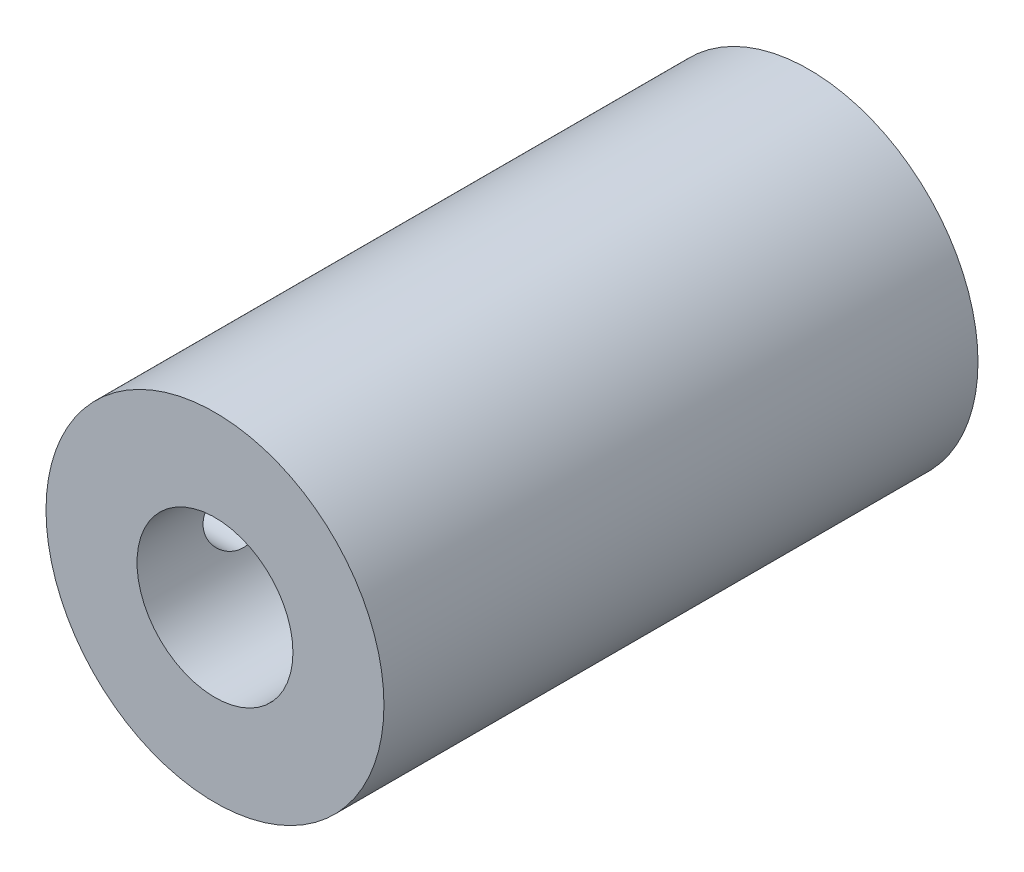
ISO-10303-21;
HEADER;
FILE_DESCRIPTION(('STEP AP214'),'2;1');
FILE_NAME('part.step','',(''),(''),'','','');
FILE_SCHEMA(('AUTOMOTIVE_DESIGN { 1 0 10303 214 1 1 1 1 }'));
ENDSEC;
DATA;
#1=APPLICATION_CONTEXT('core data for automotive mechanical design processes');
#2=APPLICATION_PROTOCOL_DEFINITION('international standard','automotive_design',2000,#1);
#3=PRODUCT_CONTEXT('',#1,'mechanical');
#4=PRODUCT('Part','Part','',(#3));
#5=PRODUCT_RELATED_PRODUCT_CATEGORY('part','',(#4));
#6=PRODUCT_DEFINITION_FORMATION('','',#4);
#7=PRODUCT_DEFINITION_CONTEXT('part definition',#1,'design');
#8=PRODUCT_DEFINITION('design','',#6,#7);
#9=PRODUCT_DEFINITION_SHAPE('','',#8);
#10=(LENGTH_UNIT() NAMED_UNIT(*) SI_UNIT(.MILLI.,.METRE.));
#11=(NAMED_UNIT(*) PLANE_ANGLE_UNIT() SI_UNIT($,.RADIAN.));
#12=(NAMED_UNIT(*) SI_UNIT($,.STERADIAN.) SOLID_ANGLE_UNIT());
#13=UNCERTAINTY_MEASURE_WITH_UNIT(LENGTH_MEASURE(1.E-05),#10,'distance_accuracy_value','');
#14=(GEOMETRIC_REPRESENTATION_CONTEXT(3) GLOBAL_UNCERTAINTY_ASSIGNED_CONTEXT((#13)) GLOBAL_UNIT_ASSIGNED_CONTEXT((#10,
#11,#12)) REPRESENTATION_CONTEXT('',''));
#15=CARTESIAN_POINT('',(0.,0.,0.));
#16=DIRECTION('',(0.,0.,1.));
#17=DIRECTION('',(1.,0.,0.));
#18=AXIS2_PLACEMENT_3D('',#15,#16,#17);
#19=CARTESIAN_POINT('',(0.,0.,57.15));
#20=DIRECTION('',(0.,0.,1.));
#21=DIRECTION('',(1.,0.,0.));
#22=AXIS2_PLACEMENT_3D('',#19,#20,#21);
#23=PLANE('',#22);
#24=CARTESIAN_POINT('',(0.,0.,57.15));
#25=DIRECTION('',(0.,0.,1.));
#26=DIRECTION('',(1.,0.,0.));
#27=AXIS2_PLACEMENT_3D('',#24,#25,#26);
#28=CIRCLE('',#27,32.512);
#29=CARTESIAN_POINT('',(32.512,0.,57.15));
#30=VERTEX_POINT('',#29);
#31=EDGE_CURVE('E10',#30,#30,#28,.T.);
#32=ORIENTED_EDGE('',*,*,#31,.T.);
#33=EDGE_LOOP('',(#32));
#34=FACE_BOUND('',#33,.T.);
#35=CARTESIAN_POINT('',(0.,0.,57.15));
#36=DIRECTION('',(0.,0.,1.));
#37=DIRECTION('',(1.,0.,0.));
#38=AXIS2_PLACEMENT_3D('',#35,#36,#37);
#39=CIRCLE('',#38,15.);
#40=CARTESIAN_POINT('',(15.,0.,57.15));
#41=VERTEX_POINT('',#40);
#42=EDGE_CURVE('E50',#41,#41,#39,.T.);
#43=ORIENTED_EDGE('',*,*,#42,.F.);
#44=EDGE_LOOP('',(#43));
#45=FACE_BOUND('',#44,.T.);
#46=ADVANCED_FACE('F37',(#34,#45),#23,.T.);
#47=CARTESIAN_POINT('',(0.,0.,-57.15));
#48=DIRECTION('',(0.,0.,1.));
#49=DIRECTION('',(1.,0.,0.));
#50=AXIS2_PLACEMENT_3D('',#47,#48,#49);
#51=PLANE('',#50);
#52=CARTESIAN_POINT('',(0.,0.,-57.15));
#53=DIRECTION('',(0.,0.,1.));
#54=DIRECTION('',(1.,0.,0.));
#55=AXIS2_PLACEMENT_3D('',#52,#53,#54);
#56=CIRCLE('',#55,32.512);
#57=CARTESIAN_POINT('',(32.512,0.,-57.15));
#58=VERTEX_POINT('',#57);
#59=EDGE_CURVE('E41',#58,#58,#56,.T.);
#60=ORIENTED_EDGE('',*,*,#59,.F.);
#61=EDGE_LOOP('',(#60));
#62=FACE_BOUND('',#61,.T.);
#63=CARTESIAN_POINT('',(0.,0.,-57.15));
#64=DIRECTION('',(0.,0.,1.));
#65=DIRECTION('',(1.,0.,0.));
#66=AXIS2_PLACEMENT_3D('',#63,#64,#65);
#67=CIRCLE('',#66,15.);
#68=CARTESIAN_POINT('',(15.,0.,-57.15));
#69=VERTEX_POINT('',#68);
#70=EDGE_CURVE('E52',#69,#69,#67,.T.);
#71=ORIENTED_EDGE('',*,*,#70,.T.);
#72=EDGE_LOOP('',(#71));
#73=FACE_BOUND('',#72,.T.);
#74=ADVANCED_FACE('F116',(#62,#73),#51,.F.);
#75=CARTESIAN_POINT('',(0.,0.,57.15));
#76=DIRECTION('',(0.,0.,-1.));
#77=DIRECTION('',(-1.,0.,0.));
#78=AXIS2_PLACEMENT_3D('',#75,#76,#77);
#79=CYLINDRICAL_SURFACE('',#78,32.512);
#80=CARTESIAN_POINT('',(0.,-32.512,3.5));
#81=CARTESIAN_POINT('',(-0.195988137658058,-32.5119975915341,3.49999155492031));
#82=CARTESIAN_POINT('',(-0.392103848105158,-32.5102090240905,3.48348254459472));
#83=CARTESIAN_POINT('',(-0.778892480967858,-32.503246074273,3.41787730173676));
#84=CARTESIAN_POINT('',(-0.969559260852604,-32.4980680168033,3.36874569692743));
#85=CARTESIAN_POINT('',(-1.33979337204176,-32.484910265371,3.23934710280458));
#86=CARTESIAN_POINT('',(-1.5193675443441,-32.4769323188493,3.15909953003361));
#87=CARTESIAN_POINT('',(-1.86246061193985,-32.459065512138,2.96978603911861));
#88=CARTESIAN_POINT('',(-2.0259825669953,-32.4491770171947,2.86072562776428));
#89=CARTESIAN_POINT('',(-2.3330440022052,-32.4285500082528,2.61639842348212));
#90=CARTESIAN_POINT('',(-2.4765076157144,-32.4178084958187,2.48103652813698));
#91=CARTESIAN_POINT('',(-2.73872747966971,-32.3967107027665,2.18815214871714));
#92=CARTESIAN_POINT('',(-2.85748255577241,-32.3863544404777,2.03062861194363));
#93=CARTESIAN_POINT('',(-3.06718743588402,-32.3671694927108,1.69741185384869));
#94=CARTESIAN_POINT('',(-3.15806782675932,-32.3583446440637,1.5216747085621));
#95=CARTESIAN_POINT('',(-3.30900035354277,-32.3432597038847,1.15732308006718));
#96=CARTESIAN_POINT('',(-3.36905336520914,-32.336999539495,0.968708962846211));
#97=CARTESIAN_POINT('',(-3.45639973962269,-32.3277804089811,0.584735759088976));
#98=CARTESIAN_POINT('',(-3.4838196875941,-32.3248086899908,0.389405779595353));
#99=CARTESIAN_POINT('',(-3.50551299696881,-32.3224635239406,-0.00310456987558333));
#100=CARTESIAN_POINT('',(-3.49978735962951,-32.3230899681878,-0.2002848837786));
#101=CARTESIAN_POINT('',(-3.45545623800254,-32.3278586916782,-0.590023387581798));
#102=CARTESIAN_POINT('',(-3.41698931038841,-32.331986154834,-0.782597544571943));
#103=CARTESIAN_POINT('',(-3.30848330181597,-32.3432687283133,-1.15854081797322));
#104=CARTESIAN_POINT('',(-3.23844373357843,-32.3504238853649,-1.34190979226678));
#105=CARTESIAN_POINT('',(-3.06862880891097,-32.366972630745,-1.6946731740357));
#106=CARTESIAN_POINT('',(-2.9687923375093,-32.3763708116155,-1.86403793748449));
#107=CARTESIAN_POINT('',(-2.74226145401603,-32.3963428926896,-2.18366074083776));
#108=CARTESIAN_POINT('',(-2.61556613040442,-32.4069168327896,-2.33391813201048));
#109=CARTESIAN_POINT('',(-2.33814177658311,-32.4281150096147,-2.61186582592699));
#110=CARTESIAN_POINT('',(-2.1872931502924,-32.4387392270135,-2.73943678966168));
#111=CARTESIAN_POINT('',(-1.86625851870228,-32.4587899623452,-2.96746419658234));
#112=CARTESIAN_POINT('',(-1.69607248614531,-32.4682164785898,-3.06792060154756));
#113=CARTESIAN_POINT('',(-1.34110867087321,-32.4848135246738,-3.23886388981305));
#114=CARTESIAN_POINT('',(-1.15632775526068,-32.4919835684896,-3.30934431770885));
#115=CARTESIAN_POINT('',(-0.777460183030065,-32.5032550280162,-3.41824545946518));
#116=CARTESIAN_POINT('',(-0.583373849320703,-32.5073565501265,-3.45666728494588));
#117=CARTESIAN_POINT('',(-0.192437856610683,-32.5120151264474,-3.50020824565802));
#118=CARTESIAN_POINT('',(0.00439326990537216,-32.5125896988246,-3.50549197883277));
#119=CARTESIAN_POINT('',(0.396138203291622,-32.510176702945,-3.48303966515436));
#120=CARTESIAN_POINT('',(0.591052040212017,-32.5071891906077,-3.45530413665515));
#121=CARTESIAN_POINT('',(0.972951431857776,-32.4979988272656,-3.36773721980575));
#122=CARTESIAN_POINT('',(1.15995495236783,-32.4918037382828,-3.30798330069913));
#123=CARTESIAN_POINT('',(1.52128483373895,-32.4768927948867,-3.15815567163437));
#124=CARTESIAN_POINT('',(1.69561086787794,-32.4681768755357,-3.06808118059595));
#125=CARTESIAN_POINT('',(2.02737894278774,-32.4491545821586,-2.85976391211357));
#126=CARTESIAN_POINT('',(2.18475302522111,-32.4388421830743,-2.74141346276595));
#127=CARTESIAN_POINT('',(2.47746102468969,-32.417802319831,-2.48005760896636));
#128=CARTESIAN_POINT('',(2.61279429848234,-32.4070748435697,-2.33705148520982));
#129=CARTESIAN_POINT('',(2.85815412155572,-32.3863607808955,-2.0297235310665));
#130=CARTESIAN_POINT('',(2.96807233313026,-32.3763774848377,-1.865314954342));
#131=CARTESIAN_POINT('',(3.15873606257725,-32.3583334122136,-1.52027493256778));
#132=CARTESIAN_POINT('',(3.23948203355378,-32.3502726057878,-1.33964373954263));
#133=CARTESIAN_POINT('',(3.36932950931284,-32.3370073330573,-0.967651246696535));
#134=CARTESIAN_POINT('',(3.41849451567803,-32.3317971380206,-0.77631232552887));
#135=CARTESIAN_POINT('',(3.48399007879071,-32.3248056376962,-0.388035742411539));
#136=CARTESIAN_POINT('',(3.50032174098656,-32.3230242169671,-0.19109826918295));
#137=CARTESIAN_POINT('',(3.49967028980366,-32.3230946734711,0.20170805462654));
#138=CARTESIAN_POINT('',(3.48285735763207,-32.3249279908079,0.397577212879774));
#139=CARTESIAN_POINT('',(3.41675180425235,-32.3319816900138,0.783690501588419));
#140=CARTESIAN_POINT('',(3.36745915466954,-32.3372020748417,0.973934627129581));
#141=CARTESIAN_POINT('',(3.23784219125406,-32.3504363898705,1.3433901516139));
#142=CARTESIAN_POINT('',(3.15752380165866,-32.3584497867286,1.52260364924073));
#143=CARTESIAN_POINT('',(2.96815248991178,-32.37636824831,1.86503416653832));
#144=CARTESIAN_POINT('',(2.85909957975963,-32.3862733122432,2.02825119288906));
#145=CARTESIAN_POINT('',(2.61471743486441,-32.4069200280989,2.33492749141207));
#146=CARTESIAN_POINT('',(2.47926127683855,-32.4176655645828,2.47828536415543));
#147=CARTESIAN_POINT('',(2.18617450738013,-32.4387472634636,2.7403072567575));
#148=CARTESIAN_POINT('',(2.02853861768916,-32.449083327663,2.85896538193858));
#149=CARTESIAN_POINT('',(1.69506328056527,-32.46821301941,3.06849522972541));
#150=CARTESIAN_POINT('',(1.51917286608502,-32.4770021330578,3.15928619298112));
#151=CARTESIAN_POINT('',(1.15465671207614,-32.4919997963383,3.30992052253017));
#152=CARTESIAN_POINT('',(0.966045452498568,-32.4982112243486,3.36979842629204));
#153=CARTESIAN_POINT('',(0.64699280047804,-32.5058107159333,3.44214403217882));
#154=CARTESIAN_POINT('',(0.518583723798975,-32.5081207388091,3.46380994765421));
#155=CARTESIAN_POINT('',(0.260135163139251,-32.5112161764176,3.49274069868829));
#156=CARTESIAN_POINT('',(0.130095687261573,-32.5120015987244,3.50000560579053));
#157=CARTESIAN_POINT('',(0.,-32.512,3.5));
#158=B_SPLINE_CURVE_WITH_KNOTS('',3,(#80,#81,#82,#83,#84,#85,#86,#87,#88,#89,#90,#91,#92,#93,
#94,#95,#96,#97,#98,#99,#100,#101,#102,#103,#104,#105,#106,#107,#108,#109,#110,#111,#112,#113,
#114,#115,#116,#117,#118,#119,#120,#121,#122,#123,#124,#125,#126,#127,#128,#129,#130,#131,#132,
#133,#134,#135,#136,#137,#138,#139,#140,#141,#142,#143,#144,#145,#146,#147,#148,#149,#150,#151,
#152,#153,#154,#155,#156,#157),.UNSPECIFIED.,.T.,.F.,(4,2,2,2,2,2,2,2,2,2,2,2,2,2,2,2,2,2,2,2,2,
2,2,2,2,2,2,2,2,2,2,2,2,2,2,2,2,2,4),(0.,0.587489314310103,1.17561667855041,1.76337763701815,
2.35102634214334,2.94084083017574,3.53068334441656,4.12198296908031,4.71326579490527,
5.30224745172805,5.89121131676452,6.4776950888052,7.06418791270661,7.65189202819732,
8.23961609204001,8.83034580692934,9.42107635450834,10.0119340531083,10.6027712630846,
11.1906714265722,11.7785623610119,12.3650372602703,12.9515272687108,13.5402871999731,
14.1290643106234,14.7203067630256,15.3115400318377,15.9015807228829,16.4916015478301,
17.0786007954386,17.6656005558577,18.2524882864516,18.8393757719657,19.4291573468929,
20.0190795142057,20.610695483418,21.2016490342503,21.5916226659203,21.9815943602141),.UNSPECIFIED.);
#159=CARTESIAN_POINT('',(0.,-32.512,3.5));
#160=VERTEX_POINT('',#159);
#161=EDGE_CURVE('E93',#160,#160,#158,.T.);
#162=ORIENTED_EDGE('',*,*,#161,.F.);
#163=EDGE_LOOP('',(#162));
#164=FACE_BOUND('',#163,.T.);
#165=CARTESIAN_POINT('',(-32.512,0.,31.75));
#166=CARTESIAN_POINT('',(-32.5120016887293,-0.176602159807082,31.7499966087641));
#167=CARTESIAN_POINT('',(-32.5105585523844,-0.353161351814694,31.7573692802022));
#168=CARTESIAN_POINT('',(-32.5048299809116,-0.705058782748434,31.7867953012497));
#169=CARTESIAN_POINT('',(-32.5005440534453,-0.880396804865951,31.8088511938244));
#170=CARTESIAN_POINT('',(-32.4892443483677,-1.22862655690052,31.8674903759749));
#171=CARTESIAN_POINT('',(-32.4822291140138,-1.40151692924858,31.9040814237767));
#172=CARTESIAN_POINT('',(-32.4656640461168,-1.74359834107074,31.9915189590452));
#173=CARTESIAN_POINT('',(-32.4561132813133,-1.91278799656666,32.0423706846215));
#174=CARTESIAN_POINT('',(-32.4347574003561,-2.24599526442921,32.1578575742648));
#175=CARTESIAN_POINT('',(-32.4229552789448,-2.410019413983,32.2224744411967));
#176=CARTESIAN_POINT('',(-32.3974084644323,-2.73206383920705,32.3650762124475));
#177=CARTESIAN_POINT('',(-32.3836630553959,-2.89008187479169,32.4430660458247));
#178=CARTESIAN_POINT('',(-32.3546155724962,-3.19891281263923,32.6117940401822));
#179=CARTESIAN_POINT('',(-32.33931420825,-3.34972895372457,32.7025263968713));
#180=CARTESIAN_POINT('',(-32.3075599733595,-3.6432843133998,32.8961639929611));
#181=CARTESIAN_POINT('',(-32.291106674044,-3.78602048906139,32.999073773901));
#182=CARTESIAN_POINT('',(-32.2573113476593,-4.06396737198189,33.2175553288928));
#183=CARTESIAN_POINT('',(-32.2399614139576,-4.19907554269305,33.3332563426647));
#184=CARTESIAN_POINT('',(-32.2050211630908,-4.45914579030272,33.5756079165574));
#185=CARTESIAN_POINT('',(-32.1874307592425,-4.58410408940359,33.7022625177337));
#186=CARTESIAN_POINT('',(-32.1525112572201,-4.82293781477474,33.9655887132862));
#187=CARTESIAN_POINT('',(-32.1351820845234,-4.93681645436059,34.1022573831092));
#188=CARTESIAN_POINT('',(-32.101259563557,-5.15278910776555,34.3847756387688));
#189=CARTESIAN_POINT('',(-32.084666489035,-5.25487875963127,34.5306285921637));
#190=CARTESIAN_POINT('',(-32.0525604335111,-5.44730323412573,34.8317327296527));
#191=CARTESIAN_POINT('',(-32.037057555077,-5.53753351135553,34.9870518439412));
#192=CARTESIAN_POINT('',(-32.0077310771142,-5.70460263183618,35.3049556925829));
#193=CARTESIAN_POINT('',(-31.993908107761,-5.78143645441505,35.4675431223691));
#194=CARTESIAN_POINT('',(-31.9683634195623,-5.92105888811862,35.7987358895413));
#195=CARTESIAN_POINT('',(-31.9566407693909,-5.98385372750218,35.9673385196919));
#196=CARTESIAN_POINT('',(-31.9356326627974,-6.09496954431065,36.3093939101622));
#197=CARTESIAN_POINT('',(-31.9263480915842,-6.14328526560585,36.4828484068578));
#198=CARTESIAN_POINT('',(-31.9028166507062,-6.26479171430735,37.004233975871));
#199=CARTESIAN_POINT('',(-31.892528565595,-6.31645908082194,37.357752084779));
#200=CARTESIAN_POINT('',(-31.8860424312432,-6.34904442064811,37.8902908754231));
#201=CARTESIAN_POINT('',(-31.8853729320443,-6.35241248602985,38.0682534338425));
#202=CARTESIAN_POINT('',(-31.8870027220047,-6.3442279925067,38.4238433960152));
#203=CARTESIAN_POINT('',(-31.8893020577279,-6.33267519957964,38.6014707944681));
#204=CARTESIAN_POINT('',(-31.9004856821443,-6.27621915883915,39.1267089634019));
#205=CARTESIAN_POINT('',(-31.9135928306721,-6.20984165439541,39.4721642721973));
#206=CARTESIAN_POINT('',(-31.9496955863877,-6.02130582922637,40.1467582555932));
#207=CARTESIAN_POINT('',(-31.9726916460043,-5.89914495633332,40.4758961828867));
#208=CARTESIAN_POINT('',(-32.0261474557354,-5.60168846580636,41.1112027494515));
#209=CARTESIAN_POINT('',(-32.0566545264941,-5.42605422904104,41.4172090252473));
#210=CARTESIAN_POINT('',(-32.1216658574928,-5.02687687803046,41.9957121085928));
#211=CARTESIAN_POINT('',(-32.1561705564521,-4.80332850316004,42.268205231467));
#212=CARTESIAN_POINT('',(-32.2260144384059,-4.3101145552833,42.7768606804358));
#213=CARTESIAN_POINT('',(-32.2613577895546,-4.03972441450775,43.0123204896568));
#214=CARTESIAN_POINT('',(-32.3283546569013,-3.46291659507378,43.4346487150129));
#215=CARTESIAN_POINT('',(-32.3600081298806,-3.15649849451366,43.6215165620346));
#216=CARTESIAN_POINT('',(-32.4161310593656,-2.51557057937647,43.9414774371207));
#217=CARTESIAN_POINT('',(-32.4405901426244,-2.18102108790852,44.0744929209714));
#218=CARTESIAN_POINT('',(-32.479489176964,-1.49374110703744,44.2822386635693));
#219=CARTESIAN_POINT('',(-32.4939302844908,-1.14101272120475,44.3569756499401));
#220=CARTESIAN_POINT('',(-32.5110060329331,-0.433427810151222,44.4450547291255));
#221=CARTESIAN_POINT('',(-32.5138256378891,-0.0786953470219535,44.4593587462885));
#222=CARTESIAN_POINT('',(-32.5078533610769,0.628091521723579,44.428752375724));
#223=CARTESIAN_POINT('',(-32.4990621004856,0.980146069593901,44.3838451557762));
#224=CARTESIAN_POINT('',(-32.4709714241727,1.66850017091416,44.2368908037442));
#225=CARTESIAN_POINT('',(-32.4517623346946,2.00490854623474,44.1353346252274));
#226=CARTESIAN_POINT('',(-32.4049815501422,2.65592278441464,43.8784984237995));
#227=CARTESIAN_POINT('',(-32.3774092505067,2.97052706907526,43.723214516894));
#228=CARTESIAN_POINT('',(-32.3164995787678,3.57307679018632,43.3612361205278));
#229=CARTESIAN_POINT('',(-32.2830982998081,3.86066572341816,43.1539592386953));
#230=CARTESIAN_POINT('',(-32.2143909909299,4.39732745024845,42.6946442220376));
#231=CARTESIAN_POINT('',(-32.1790847671675,4.64639631410343,42.4426015259177));
#232=CARTESIAN_POINT('',(-32.109928679655,5.1026210943753,41.8966052884571));
#233=CARTESIAN_POINT('',(-32.0761073055025,5.30911791204254,41.602097740244));
#234=CARTESIAN_POINT('',(-32.0143356174298,5.66975735098072,40.9818115617374));
#235=CARTESIAN_POINT('',(-31.9863850745921,5.82390201372909,40.6560341514507));
#236=CARTESIAN_POINT('',(-31.9513809946409,6.01193231647523,40.1521377490732));
#237=CARTESIAN_POINT('',(-31.9408809145982,6.06734240703577,39.9819940793897));
#238=CARTESIAN_POINT('',(-31.9224394510239,6.16363825111149,39.6375252116311));
#239=CARTESIAN_POINT('',(-31.914497131452,6.20452931858497,39.4632015684144));
#240=CARTESIAN_POINT('',(-31.9014126530402,6.27145699018935,39.1116175039844));
#241=CARTESIAN_POINT('',(-31.8962707460447,6.29749225833137,38.9343568201163));
#242=CARTESIAN_POINT('',(-31.8889423499701,6.33449754129185,38.5782107791845));
#243=CARTESIAN_POINT('',(-31.8867557531126,6.34546810551153,38.3993254816089));
#244=CARTESIAN_POINT('',(-31.8854164398573,6.35219427234065,38.0443538350264));
#245=CARTESIAN_POINT('',(-31.886211953158,6.34820950246738,37.8682725324916));
#246=CARTESIAN_POINT('',(-31.8906977622183,6.32563613201158,37.5170883858007));
#247=CARTESIAN_POINT('',(-31.894388003964,6.30704780392317,37.3419855234488));
#248=CARTESIAN_POINT('',(-31.904555628774,6.25541084660078,36.9939778205225));
#249=CARTESIAN_POINT('',(-31.9110334884117,6.22235974478313,36.8210733609949));
#250=CARTESIAN_POINT('',(-31.9265843225604,6.14207021484257,36.4787763364809));
#251=CARTESIAN_POINT('',(-31.9356563700129,6.09483685458818,36.3093825400753));
#252=CARTESIAN_POINT('',(-31.9561150355424,5.9866416427995,35.9755341373992));
#253=CARTESIAN_POINT('',(-31.9674973015973,5.92570558164878,35.8110709017719));
#254=CARTESIAN_POINT('',(-31.9922584405732,5.7905319290815,35.4879313839254));
#255=CARTESIAN_POINT('',(-32.0056366055139,5.71629905241182,35.3292530744276));
#256=CARTESIAN_POINT('',(-32.0340228262748,5.55501835091317,35.0186187657404));
#257=CARTESIAN_POINT('',(-32.0490315524099,5.46796525048983,34.8666655676108));
#258=CARTESIAN_POINT('',(-32.0802526403924,5.28170846197777,34.5706045783677));
#259=CARTESIAN_POINT('',(-32.0964645868975,5.18250895911848,34.4264941095059));
#260=CARTESIAN_POINT('',(-32.1299283099282,4.97086656010199,34.1446806892537));
#261=CARTESIAN_POINT('',(-32.1471928768459,4.85823122690573,34.0071237373989));
#262=CARTESIAN_POINT('',(-32.1820216449737,4.62189192694554,33.7420026396424));
#263=CARTESIAN_POINT('',(-32.1995857385159,4.49819187234851,33.6144349914955));
#264=CARTESIAN_POINT('',(-32.2345413113329,4.24044917346016,33.3700263545268));
#265=CARTESIAN_POINT('',(-32.2519326821528,4.10640044381951,33.2531917668775));
#266=CARTESIAN_POINT('',(-32.2860432352847,3.82897859480911,33.0311761545678));
#267=CARTESIAN_POINT('',(-32.3027626627509,3.68560892702832,32.9259908546894));
#268=CARTESIAN_POINT('',(-32.3352392279339,3.38894334095262,32.7269378209407));
#269=CARTESIAN_POINT('',(-32.3509846796739,3.23556038901374,32.6331978235907));
#270=CARTESIAN_POINT('',(-32.3808711680076,2.92133936002422,32.4590307760273));
#271=CARTESIAN_POINT('',(-32.3950127949618,2.76050405705841,32.3785988221474));
#272=CARTESIAN_POINT('',(-32.4212874276069,2.432549154217,32.2316557808447));
#273=CARTESIAN_POINT('',(-32.4334216745747,2.26543351688459,32.1651360839083));
#274=CARTESIAN_POINT('',(-32.4553431220064,1.926079236736,32.0464853422129));
#275=CARTESIAN_POINT('',(-32.4651307824605,1.75384160541284,31.9943514771649));
#276=CARTESIAN_POINT('',(-32.4861258139016,1.3221439225647,31.8834874133768));
#277=CARTESIAN_POINT('',(-32.4957790382063,1.06031042491715,31.8334965500122));
#278=CARTESIAN_POINT('',(-32.5087147656899,0.532285350044574,31.7667558851373));
#279=CARTESIAN_POINT('',(-32.5119974555205,0.26609390073459,31.7500051097178));
#280=CARTESIAN_POINT('',(-32.512,0.,31.75));
#281=B_SPLINE_CURVE_WITH_KNOTS('',3,(#165,#166,#167,#168,#169,#170,#171,#172,#173,#174,#175,
#176,#177,#178,#179,#180,#181,#182,#183,#184,#185,#186,#187,#188,#189,#190,#191,#192,#193,#194,
#195,#196,#197,#198,#199,#200,#201,#202,#203,#204,#205,#206,#207,#208,#209,#210,#211,#212,#213,
#214,#215,#216,#217,#218,#219,#220,#221,#222,#223,#224,#225,#226,#227,#228,#229,#230,#231,#232,
#233,#234,#235,#236,#237,#238,#239,#240,#241,#242,#243,#244,#245,#246,#247,#248,#249,#250,#251,
#252,#253,#254,#255,#256,#257,#258,#259,#260,#261,#262,#263,#264,#265,#266,#267,#268,#269,#270,
#271,#272,#273,#274,#275,#276,#277,#278,#279,#280),.UNSPECIFIED.,.T.,.F.,(4,2,2,2,2,2,2,2,2,2,2,
2,2,2,2,2,2,2,2,2,2,2,2,2,2,2,2,2,2,2,2,2,2,2,2,2,2,2,2,2,2,2,2,2,2,2,2,2,2,2,2,2,2,2,2,2,2,4),
(0.,0.529572890188593,1.05923752019195,1.58918524255536,2.11932787629711,2.64877017354801,
3.17840803575998,3.70780542273493,4.23740087309335,4.77294489752799,5.30868734748042,
5.84427395568624,6.3800581015176,6.92028715870093,7.46071824768892,8.00090910178718,
8.54129581611107,9.60736036725825,10.1408258598928,10.6742997196243,11.7249672374627,
12.7756828296384,13.8331955550117,14.8908244471493,15.9665754038923,17.0423389593603,
18.1196460878807,19.1968288345014,20.2567996828716,21.3167138254861,22.3675817272649,
23.4185256124939,24.4818127395284,25.5452082696194,26.6240012670084,27.7027521919272,
28.2399542933079,28.7769595757092,29.3140131436347,29.8510471250008,30.3788015655476,
30.9065461587292,31.4343810114141,31.9620274723444,32.4886890203658,33.0151641945726,
33.5418566248031,34.0683680830861,34.6036160401726,35.1386754914597,35.6740520069611,
36.2092313868581,36.7499233716226,37.290415679668,37.8305725111963,38.3706233716254,
39.1685764948691,39.9665062383531),.UNSPECIFIED.);
#282=CARTESIAN_POINT('',(-32.512,0.,31.75));
#283=VERTEX_POINT('',#282);
#284=EDGE_CURVE('E56',#283,#283,#281,.T.);
#285=ORIENTED_EDGE('',*,*,#284,.F.);
#286=EDGE_LOOP('',(#285));
#287=FACE_BOUND('',#286,.T.);
#288=ORIENTED_EDGE('',*,*,#31,.F.);
#289=EDGE_LOOP('',(#288));
#290=FACE_BOUND('',#289,.T.);
#291=ORIENTED_EDGE('',*,*,#59,.T.);
#292=EDGE_LOOP('',(#291));
#293=FACE_BOUND('',#292,.T.);
#294=ADVANCED_FACE('F39',(#164,#287,#290,#293),#79,.T.);
#295=CARTESIAN_POINT('',(0.,0.,57.15));
#296=DIRECTION('',(0.,0.,-1.));
#297=DIRECTION('',(-1.,0.,0.));
#298=AXIS2_PLACEMENT_3D('',#295,#296,#297);
#299=CYLINDRICAL_SURFACE('',#298,15.);
#300=CARTESIAN_POINT('',(0.,-15.,3.5));
#301=CARTESIAN_POINT('',(-0.193784137952152,-14.9999965115519,3.49999387624454));
#302=CARTESIAN_POINT('',(-0.387639630451045,-14.9962069430166,3.48385189739104));
#303=CARTESIAN_POINT('',(-0.769821779223511,-14.9814561277669,3.41979084673213));
#304=CARTESIAN_POINT('',(-0.958144771846936,-14.9704902359375,3.3718511925463));
#305=CARTESIAN_POINT('',(-1.32368533954953,-14.9426047451141,3.24579577561659));
#306=CARTESIAN_POINT('',(-1.50091505139967,-14.9256917916238,3.16771368584102));
#307=CARTESIAN_POINT('',(-1.83975614055302,-14.8877265965611,2.9837020851302));
#308=CARTESIAN_POINT('',(-2.00136749418353,-14.866674348715,2.87777253198752));
#309=CARTESIAN_POINT('',(-2.30731489812197,-14.8223011013806,2.63904410004723));
#310=CARTESIAN_POINT('',(-2.45132761449086,-14.7989487983764,2.50583663457392));
#311=CARTESIAN_POINT('',(-2.71518309617675,-14.7528221654408,2.21720974224384));
#312=CARTESIAN_POINT('',(-2.83502345981832,-14.7300478931368,2.06178811088847));
#313=CARTESIAN_POINT('',(-3.04860129330758,-14.6873442875787,1.730699957379));
#314=CARTESIAN_POINT('',(-3.14198666775757,-14.6674549062732,1.55480068919163));
#315=CARTESIAN_POINT('',(-3.29774259261956,-14.6332257531189,1.18926327815826));
#316=CARTESIAN_POINT('',(-3.36011740738543,-14.6188852182919,0.999627028436561));
#317=CARTESIAN_POINT('',(-3.45099741108894,-14.5976976559549,0.615528455833377));
#318=CARTESIAN_POINT('',(-3.48007917546477,-14.5907232309007,0.421209737772121));
#319=CARTESIAN_POINT('',(-3.50534181899307,-14.5846755414634,0.0303359777990917));
#320=CARTESIAN_POINT('',(-3.50152732517642,-14.5856011658969,-0.166218745722903));
#321=CARTESIAN_POINT('',(-3.46156792517088,-14.5951340155701,-0.551639742865662));
#322=CARTESIAN_POINT('',(-3.42610047829005,-14.6035802702438,-0.740580846598736));
#323=CARTESIAN_POINT('',(-3.32491859697389,-14.6269472911163,-1.10975464901582));
#324=CARTESIAN_POINT('',(-3.25920225732111,-14.6418684651324,-1.28998679837872));
#325=CARTESIAN_POINT('',(-3.09878638272157,-14.6766577657871,-1.63849121224424));
#326=CARTESIAN_POINT('',(-3.00383300137999,-14.6965689237626,-1.80664215662584));
#327=CARTESIAN_POINT('',(-2.78781645249983,-14.7390692824617,-2.12487111526294));
#328=CARTESIAN_POINT('',(-2.66674926527766,-14.7616588952371,-2.27494634158464));
#329=CARTESIAN_POINT('',(-2.39839030255396,-14.8076557763522,-2.55665622814388));
#330=CARTESIAN_POINT('',(-2.25052437664276,-14.8310694551794,-2.68774350856149));
#331=CARTESIAN_POINT('',(-1.9346349763891,-14.8755702268205,-2.92335631141545));
#332=CARTESIAN_POINT('',(-1.76661103248123,-14.8966572654152,-3.02788121492488));
#333=CARTESIAN_POINT('',(-1.41445626746104,-14.9342128332282,-3.20756672939339));
#334=CARTESIAN_POINT('',(-1.23028348100803,-14.9506688316045,-3.28264788204249));
#335=CARTESIAN_POINT('',(-0.851464037942172,-14.9770161321503,-3.40063927866269));
#336=CARTESIAN_POINT('',(-0.656819125765463,-14.9869085240409,-3.44355486306745));
#337=CARTESIAN_POINT('',(-0.267268971150076,-14.9988561100693,-3.49518284083102));
#338=CARTESIAN_POINT('',(-0.0724677916381063,-15.0010823595802,-3.50464188570285));
#339=CARTESIAN_POINT('',(0.315932113821857,-14.9979297095677,-3.49112291342314));
#340=CARTESIAN_POINT('',(0.509530932076706,-14.9925514012903,-3.46814741802099));
#341=CARTESIAN_POINT('',(0.887502140383551,-14.9749026714701,-3.39102923743028));
#342=CARTESIAN_POINT('',(1.07196037166015,-14.9627204698685,-3.33728528006232));
#343=CARTESIAN_POINT('',(1.42923974886029,-14.9328310046996,-3.20060413158072));
#344=CARTESIAN_POINT('',(1.60205981262503,-14.9151232282043,-3.11766423017565));
#345=CARTESIAN_POINT('',(1.93419216408187,-14.8757298960092,-2.92343924613642));
#346=CARTESIAN_POINT('',(2.09324620223298,-14.853985608915,-2.81172473369439));
#347=CARTESIAN_POINT('',(2.39061697573014,-14.8090380235616,-2.56367953058918));
#348=CARTESIAN_POINT('',(2.52893061349434,-14.7858345080995,-2.42734516963693));
#349=CARTESIAN_POINT('',(2.7839035963455,-14.7399813413049,-2.13048426114972));
#350=CARTESIAN_POINT('',(2.90004264743098,-14.7173538079345,-1.96950674301254));
#351=CARTESIAN_POINT('',(3.10364669381195,-14.6757697810452,-1.62989797088969));
#352=CARTESIAN_POINT('',(3.1911129682985,-14.6568131237713,-1.45126750492554));
#353=CARTESIAN_POINT('',(3.33426336350659,-14.6249126362429,-1.08239885002123));
#354=CARTESIAN_POINT('',(3.39013314349096,-14.6119337662993,-0.892235895547425));
#355=CARTESIAN_POINT('',(3.46902748521753,-14.5934067634408,-0.504873790683522));
#356=CARTESIAN_POINT('',(3.49205814923189,-14.5878572499902,-0.307675954520976));
#357=CARTESIAN_POINT('',(3.50433347752162,-14.584912667346,0.0828913737612458));
#358=CARTESIAN_POINT('',(3.49440587359158,-14.587317814717,0.27623379112492));
#359=CARTESIAN_POINT('',(3.44291677070363,-14.5995551703339,0.658407599474161));
#360=CARTESIAN_POINT('',(3.4013557565164,-14.6093872647646,0.847239059542798));
#361=CARTESIAN_POINT('',(3.28820379045376,-14.6352668354349,1.21426372615175));
#362=CARTESIAN_POINT('',(3.2167490620074,-14.6512860921238,1.39250105362967));
#363=CARTESIAN_POINT('',(3.04594967103166,-14.6877426002072,1.73457498987926));
#364=CARTESIAN_POINT('',(2.94660165353055,-14.7081803829888,1.89840986322621));
#365=CARTESIAN_POINT('',(2.7201585866869,-14.7517556913361,2.2110727577045));
#366=CARTESIAN_POINT('',(2.59248054370767,-14.774944299335,2.35947151022482));
#367=CARTESIAN_POINT('',(2.3141630949655,-14.8210832750732,2.6330076540204));
#368=CARTESIAN_POINT('',(2.16351833655363,-14.8440335859394,2.75813960757976));
#369=CARTESIAN_POINT('',(1.84077844033564,-14.8875256137278,2.98342953154295));
#370=CARTESIAN_POINT('',(1.66839179670122,-14.9080253687725,3.08317853474258));
#371=CARTESIAN_POINT('',(1.30884565921883,-14.9438767035044,3.25212392154892));
#372=CARTESIAN_POINT('',(1.12169789009735,-14.9592323192939,3.32134427156146));
#373=CARTESIAN_POINT('',(0.778820460452157,-14.9805348122389,3.41585053901395));
#374=CARTESIAN_POINT('',(0.624852371440717,-14.9877868653169,3.44734286970268));
#375=CARTESIAN_POINT('',(0.313938352333354,-14.9975207365361,3.48941948584295));
#376=CARTESIAN_POINT('',(0.156992592210722,-15.0000028261369,3.50000496110906));
#377=CARTESIAN_POINT('',(0.,-15.,3.5));
#378=B_SPLINE_CURVE_WITH_KNOTS('',3,(#300,#301,#302,#303,#304,#305,#306,#307,#308,#309,#310,
#311,#312,#313,#314,#315,#316,#317,#318,#319,#320,#321,#322,#323,#324,#325,#326,#327,#328,#329,
#330,#331,#332,#333,#334,#335,#336,#337,#338,#339,#340,#341,#342,#343,#344,#345,#346,#347,#348,
#349,#350,#351,#352,#353,#354,#355,#356,#357,#358,#359,#360,#361,#362,#363,#364,#365,#366,#367,
#368,#369,#370,#371,#372,#373,#374,#375,#376,#377),.UNSPECIFIED.,.T.,.F.,(4,2,2,2,2,2,2,2,2,2,2,
2,2,2,2,2,2,2,2,2,2,2,2,2,2,2,2,2,2,2,2,2,2,2,2,2,2,2,4),(0.,0.580777464798396,1.16193122954238,
1.74243764099044,2.32294493229703,2.91288378595792,3.50288122491675,4.1003971238363,
4.69783083383343,5.28475364798466,5.87159390971672,6.44616762988456,7.0207775443591,
7.60052424242324,8.18036024433978,8.77452578521074,9.368705169396,9.96447717803257,
10.560150249007,11.1424427185298,11.7246899179547,12.2995572707964,12.8744780032827,
13.4585334781478,14.0426760950908,14.639182564126,15.2356624173355,15.8285999680459,
16.4214273227918,16.9994798419643,17.5775235028672,18.1529612694788,18.7284682787354,
19.3171466013144,19.9059623322658,20.5037373134514,21.1010421746357,21.5715809403711,
22.0420929268516),.UNSPECIFIED.);
#379=CARTESIAN_POINT('',(0.,-15.,3.5));
#380=VERTEX_POINT('',#379);
#381=EDGE_CURVE('E89',#380,#380,#378,.T.);
#382=ORIENTED_EDGE('',*,*,#381,.T.);
#383=EDGE_LOOP('',(#382));
#384=FACE_BOUND('',#383,.T.);
#385=CARTESIAN_POINT('',(-15.,0.,31.75));
#386=CARTESIAN_POINT('',(-14.9999990298815,-0.1699064023444,31.7500011976975));
#387=CARTESIAN_POINT('',(-14.9971053525193,-0.339866931473285,31.7568284233148));
#388=CARTESIAN_POINT('',(-14.985602605222,-0.678574796650852,31.7840730118623));
#389=CARTESIAN_POINT('',(-14.9769900010294,-0.847321317224313,31.8044987786179));
#390=CARTESIAN_POINT('',(-14.9542536860188,-1.18261747580641,31.8587812116959));
#391=CARTESIAN_POINT('',(-14.9401189027042,-1.34916200058934,31.8926648646507));
#392=CARTESIAN_POINT('',(-14.9067032526025,-1.67857762477833,31.9735282303777));
#393=CARTESIAN_POINT('',(-14.8874202825863,-1.84144719326622,32.0205132959227));
#394=CARTESIAN_POINT('',(-14.8442890691298,-2.16173396714073,32.126912662699));
#395=CARTESIAN_POINT('',(-14.8204587942813,-2.31916984472343,32.1862781260353));
#396=CARTESIAN_POINT('',(-14.7687656171467,-2.6283344492843,32.317047078597));
#397=CARTESIAN_POINT('',(-14.740901206937,-2.78006101533531,32.3884550708643));
#398=CARTESIAN_POINT('',(-14.6818342466377,-3.07678442073567,32.542678013476));
#399=CARTESIAN_POINT('',(-14.6506341010179,-3.22178600093411,32.6254847595687));
#400=CARTESIAN_POINT('',(-14.5856110322513,-3.50442917085619,32.8019561440635));
#401=CARTESIAN_POINT('',(-14.5517871584289,-3.64206806199105,32.8956247242589));
#402=CARTESIAN_POINT('',(-14.4442911870015,-4.05533232791947,33.2012629664621));
#403=CARTESIAN_POINT('',(-14.3674420785375,-4.31749280313752,33.4307121310868));
#404=CARTESIAN_POINT('',(-14.2132265204279,-4.80091619590442,33.9293434465511));
#405=CARTESIAN_POINT('',(-14.1358598136117,-5.02215693188027,34.1985470058999));
#406=CARTESIAN_POINT('',(-14.023658299964,-5.32441378899257,34.6349373157449));
#407=CARTESIAN_POINT('',(-13.9860399255722,-5.42220217832895,34.7900257385117));
#408=CARTESIAN_POINT('',(-13.9140841069727,-5.60426955911078,35.1086314639398));
#409=CARTESIAN_POINT('',(-13.8797453043368,-5.68855415383717,35.2721452331605));
#410=CARTESIAN_POINT('',(-13.8154848648365,-5.84289093850063,35.6065979524921));
#411=CARTESIAN_POINT('',(-13.7855633792707,-5.91294264097429,35.777537156674));
#412=CARTESIAN_POINT('',(-13.7312178743078,-6.03807193719994,36.1255743677208));
#413=CARTESIAN_POINT('',(-13.7067909995488,-6.09315731155049,36.3026691202564));
#414=CARTESIAN_POINT('',(-13.6653825547131,-6.18544688914805,36.6529571685979));
#415=CARTESIAN_POINT('',(-13.6480957814198,-6.22339261846944,36.825918999964));
#416=CARTESIAN_POINT('',(-13.6199557585226,-6.28473934535191,37.1748459541028));
#417=CARTESIAN_POINT('',(-13.6090995071553,-6.30814712946438,37.3508096360856));
#418=CARTESIAN_POINT('',(-13.5942225293899,-6.34014406638725,37.7043192676497));
#419=CARTESIAN_POINT('',(-13.5901999013461,-6.34873734175646,37.8818647632179));
#420=CARTESIAN_POINT('',(-13.5891410043127,-6.3510039132296,38.2370670130291));
#421=CARTESIAN_POINT('',(-13.5921043494668,-6.34467803336318,38.4147237605855));
#422=CARTESIAN_POINT('',(-13.6043871334782,-6.31829373963928,38.7544747338376));
#423=CARTESIAN_POINT('',(-13.6131796820044,-6.29937319968157,38.9166780163593));
#424=CARTESIAN_POINT('',(-13.6362964659552,-6.24917451187607,39.2388143340938));
#425=CARTESIAN_POINT('',(-13.6506225051062,-6.21789233448571,39.3987466113954));
#426=CARTESIAN_POINT('',(-13.6843552861087,-6.14329649004044,39.7151873007675));
#427=CARTESIAN_POINT('',(-13.7037608990141,-6.09998549628526,39.8716964652675));
#428=CARTESIAN_POINT('',(-13.7470840235181,-6.00171327046783,40.1804311240435));
#429=CARTESIAN_POINT('',(-13.771003276746,-5.94674754030348,40.332654938636));
#430=CARTESIAN_POINT('',(-13.8232221018339,-5.82434958700432,40.6350787114451));
#431=CARTESIAN_POINT('',(-13.8516037342961,-5.75667793424137,40.7851674790617));
#432=CARTESIAN_POINT('',(-13.9115878477041,-5.61016829425068,41.0791777454606));
#433=CARTESIAN_POINT('',(-13.9431914141513,-5.53132654019563,41.2230971423691));
#434=CARTESIAN_POINT('',(-14.0087925202195,-5.36301116945978,41.5040313126811));
#435=CARTESIAN_POINT('',(-14.0427904219452,-5.27353594322442,41.6410450363136));
#436=CARTESIAN_POINT('',(-14.1123379996699,-5.08449203334749,41.9075096812432));
#437=CARTESIAN_POINT('',(-14.1478877654727,-4.98492276513907,42.0369601638523));
#438=CARTESIAN_POINT('',(-14.2228535957266,-4.76705793996798,42.2987067915629));
#439=CARTESIAN_POINT('',(-14.2623351860458,-4.64788583736906,42.4302558129726));
#440=CARTESIAN_POINT('',(-14.3410675831354,-4.39895615457205,42.6829170213457));
#441=CARTESIAN_POINT('',(-14.3803184527062,-4.26920161288223,42.8040321837614));
#442=CARTESIAN_POINT('',(-14.4575932574995,-3.99970691298349,43.0352183991843));
#443=CARTESIAN_POINT('',(-14.4956164132074,-3.8599605848667,43.1452825255803));
#444=CARTESIAN_POINT('',(-14.569398386517,-3.57138617717416,43.353507952328));
#445=CARTESIAN_POINT('',(-14.6051581057107,-3.42256176064478,43.4516740064632));
#446=CARTESIAN_POINT('',(-14.6743416957405,-3.11279641443311,43.6377297113989));
#447=CARTESIAN_POINT('',(-14.707684590428,-2.95164532688424,43.725300251111));
#448=CARTESIAN_POINT('',(-14.7700568352138,-2.62175224123876,43.8864147626518));
#449=CARTESIAN_POINT('',(-14.7990879410946,-2.45301336959375,43.9599644473224));
#450=CARTESIAN_POINT('',(-14.8519998992825,-2.10911222505826,44.092335332487));
#451=CARTESIAN_POINT('',(-14.8758820068844,-1.93395152998138,44.1511601233858));
#452=CARTESIAN_POINT('',(-14.9177842073612,-1.57851961097207,44.2534515658541));
#453=CARTESIAN_POINT('',(-14.9358047618673,-1.39824879070791,44.2969194268941));
#454=CARTESIAN_POINT('',(-14.9644668733281,-1.04590659823148,44.3656745527515));
#455=CARTESIAN_POINT('',(-14.9755112745311,-0.874061932357784,44.3919582781827));
#456=CARTESIAN_POINT('',(-14.9916833570902,-0.528523505837559,44.4303534787462));
#457=CARTESIAN_POINT('',(-14.9968113755613,-0.354829851115489,44.4424657613667));
#458=CARTESIAN_POINT('',(-15.0010064597614,-0.00700591354580528,44.4523786599225));
#459=CARTESIAN_POINT('',(-15.0000750471021,0.167124248710328,44.4501828688237));
#460=CARTESIAN_POINT('',(-14.992180949155,0.514476994764133,44.4315133799038));
#461=CARTESIAN_POINT('',(-14.9852184060281,0.687699599857151,44.4150400186216));
#462=CARTESIAN_POINT('',(-14.965971346105,1.02294686578374,44.369226715832));
#463=CARTESIAN_POINT('',(-14.9539815193216,1.18508641378226,44.3405982599874));
#464=CARTESIAN_POINT('',(-14.9250499473898,1.5062847263712,44.2709496446278));
#465=CARTESIAN_POINT('',(-14.9081065929465,1.66534247181544,44.22992545786));
#466=CARTESIAN_POINT('',(-14.8696857622626,1.97925386529456,44.1358839086641));
#467=CARTESIAN_POINT('',(-14.8482095728267,2.13410869242482,44.0828699496498));
#468=CARTESIAN_POINT('',(-14.8012184474955,2.43879170821349,43.96527682237));
#469=CARTESIAN_POINT('',(-14.7757019729282,2.5886179553721,43.9006932467826));
#470=CARTESIAN_POINT('',(-14.7203821840238,2.88687659738502,43.7583199972938));
#471=CARTESIAN_POINT('',(-14.6904710724147,3.035124053418,43.6801849489978));
#472=CARTESIAN_POINT('',(-14.627685690369,3.32456808054586,43.5127362262983));
#473=CARTESIAN_POINT('',(-14.5948104081427,3.46576221830981,43.4234187308064));
#474=CARTESIAN_POINT('',(-14.5268640365292,3.74035168185912,43.2342063561704));
#475=CARTESIAN_POINT('',(-14.4917925487731,3.87374558422676,43.1343095557649));
#476=CARTESIAN_POINT('',(-14.4202653063182,4.13205922134771,42.9245488677736));
#477=CARTESIAN_POINT('',(-14.383809481704,4.25697852720403,42.8146844763876));
#478=CARTESIAN_POINT('',(-14.307637148894,4.50663811563153,42.5771147955128));
#479=CARTESIAN_POINT('',(-14.2678787679935,4.63068296747691,42.4486910569975));
#480=CARTESIAN_POINT('',(-14.1888180788901,4.86754868711403,42.1818246708565));
#481=CARTESIAN_POINT('',(-14.149515636736,4.98037292919649,42.0433850569964));
#482=CARTESIAN_POINT('',(-14.0724208293137,5.19421807928185,41.7571213619415));
#483=CARTESIAN_POINT('',(-14.0346294692165,5.29523121375122,41.6092911979771));
#484=CARTESIAN_POINT('',(-13.9617019368144,5.48463092840034,41.305213415372));
#485=CARTESIAN_POINT('',(-13.9265646581402,5.57302278366921,41.1489693511621));
#486=CARTESIAN_POINT('',(-13.8594531218709,5.73791079012295,40.8262181532003));
#487=CARTESIAN_POINT('',(-13.8275420317875,5.81418176380194,40.6595825695162));
#488=CARTESIAN_POINT('',(-13.768672650476,5.95225079721014,40.3196500882173));
#489=CARTESIAN_POINT('',(-13.7417122015619,6.01405516530266,40.1463561325993));
#490=CARTESIAN_POINT('',(-13.6937231600007,6.12253770570693,39.7943808929128));
#491=CARTESIAN_POINT('',(-13.6726916540166,6.16922330869226,39.6157023026663));
#492=CARTESIAN_POINT('',(-13.6373618630042,6.24693458751152,39.2543207493658));
#493=CARTESIAN_POINT('',(-13.6230629154011,6.27796180436438,39.0716181841786));
#494=CARTESIAN_POINT('',(-13.6026176110531,6.32213044828446,38.7183152874346));
#495=CARTESIAN_POINT('',(-13.5959166590155,6.33649072797363,38.547898501596));
#496=CARTESIAN_POINT('',(-13.5889536387704,6.35141008006487,38.2063334768055));
#497=CARTESIAN_POINT('',(-13.5886912290917,6.35196988438193,38.035185277126));
#498=CARTESIAN_POINT('',(-13.594614263817,6.33928310654505,37.6935424870249));
#499=CARTESIAN_POINT('',(-13.6007987423443,6.32603859256231,37.5230478025337));
#500=CARTESIAN_POINT('',(-13.6193931759765,6.28590621921222,37.1840194914238));
#501=CARTESIAN_POINT('',(-13.6318030711227,6.25901849124649,37.0154858459338));
#502=CARTESIAN_POINT('',(-13.6616515372596,6.1935852387457,36.6899737094922));
#503=CARTESIAN_POINT('',(-13.6788083509098,6.15568821884205,36.5328382043616));
#504=CARTESIAN_POINT('',(-13.7178399768303,6.06820888516759,36.2224064203763));
#505=CARTESIAN_POINT('',(-13.7397163110356,6.01862280146804,36.0691113978276));
#506=CARTESIAN_POINT('',(-13.7875581361055,5.90820249030454,35.7673076802184));
#507=CARTESIAN_POINT('',(-13.8135230876355,5.84736974621805,35.6187983569784));
#508=CARTESIAN_POINT('',(-13.8688441139627,5.71492008389832,35.3273027188366));
#509=CARTESIAN_POINT('',(-13.8982014241885,5.64329923395404,35.1843184415014));
#510=CARTESIAN_POINT('',(-13.9939825297685,5.403632015458,34.7477332487173));
#511=CARTESIAN_POINT('',(-14.0650839485438,5.21745486483342,34.4648663922456));
#512=CARTESIAN_POINT('',(-14.2118468942677,4.80328273250847,33.9329019998748));
#513=CARTESIAN_POINT('',(-14.2875100763049,4.57527251097838,33.6838168283797));
#514=CARTESIAN_POINT('',(-14.4017578070447,4.19626553586703,33.330641050363));
#515=CARTESIAN_POINT('',(-14.441345029758,4.05826557044096,33.2126711415963));
#516=CARTESIAN_POINT('',(-14.518648672488,3.77236433974355,32.9887672003224));
#517=CARTESIAN_POINT('',(-14.5563657605307,3.62446665502099,32.8828288523444));
#518=CARTESIAN_POINT('',(-14.6289314541316,3.31948226331024,32.6836593354143));
#519=CARTESIAN_POINT('',(-14.6637773590817,3.16238713754486,32.5904400770723));
#520=CARTESIAN_POINT('',(-14.7295764510132,2.84017496620149,32.4176321084688));
#521=CARTESIAN_POINT('',(-14.7605314301527,2.67506166273596,32.3380371167208));
#522=CARTESIAN_POINT('',(-14.8172517997144,2.34038904427577,32.1942612354982));
#523=CARTESIAN_POINT('',(-14.8430879415375,2.17093328876681,32.1298674333153));
#524=CARTESIAN_POINT('',(-14.8893891643646,1.82654155961093,32.015664728975));
#525=CARTESIAN_POINT('',(-14.9098568016774,1.65160823878583,31.9658488839526));
#526=CARTESIAN_POINT('',(-14.9447891716513,1.29798732214826,31.8814232310966));
#527=CARTESIAN_POINT('',(-14.9592686165522,1.11931007442192,31.8467761430858));
#528=CARTESIAN_POINT('',(-14.9818518951009,0.759333734654731,31.792941316934));
#529=CARTESIAN_POINT('',(-14.9899603491595,0.578036639954005,31.7737423751462));
#530=CARTESIAN_POINT('',(-14.9965087572984,0.330288636083443,31.7582508486893));
#531=CARTESIAN_POINT('',(-14.9978171974222,0.264278543105707,31.7551576939332));
#532=CARTESIAN_POINT('',(-14.999563009486,0.132181697273057,31.7510320318506));
#533=CARTESIAN_POINT('',(-15.0000003773838,0.0660949440638441,31.7499995340861));
#534=CARTESIAN_POINT('',(-15.,0.,31.75));
#535=B_SPLINE_CURVE_WITH_KNOTS('',3,(#385,#386,#387,#388,#389,#390,#391,#392,#393,#394,#395,
#396,#397,#398,#399,#400,#401,#402,#403,#404,#405,#406,#407,#408,#409,#410,#411,#412,#413,#414,
#415,#416,#417,#418,#419,#420,#421,#422,#423,#424,#425,#426,#427,#428,#429,#430,#431,#432,#433,
#434,#435,#436,#437,#438,#439,#440,#441,#442,#443,#444,#445,#446,#447,#448,#449,#450,#451,#452,
#453,#454,#455,#456,#457,#458,#459,#460,#461,#462,#463,#464,#465,#466,#467,#468,#469,#470,#471,
#472,#473,#474,#475,#476,#477,#478,#479,#480,#481,#482,#483,#484,#485,#486,#487,#488,#489,#490,
#491,#492,#493,#494,#495,#496,#497,#498,#499,#500,#501,#502,#503,#504,#505,#506,#507,#508,#509,
#510,#511,#512,#513,#514,#515,#516,#517,#518,#519,#520,#521,#522,#523,#524,#525,#526,#527,#528,
#529,#530,#531,#532,#533,#534),.UNSPECIFIED.,.T.,.F.,(4,2,2,2,2,2,2,2,2,2,2,2,2,2,2,2,2,2,2,2,2,
2,2,2,2,2,2,2,2,2,2,2,2,2,2,2,2,2,2,2,2,2,2,2,2,2,2,2,2,2,2,2,2,2,2,2,2,2,2,2,2,2,2,2,2,2,2,2,2,
2,2,2,2,2,4),(0.,0.50965218106599,1.01961961717239,1.53061487846264,2.04181922097529,
2.55104388152307,3.06045937948178,3.56951012434247,4.07874618686597,5.14412037470323,
6.21007039354934,6.77096394122901,7.33162414490005,7.89230354742908,8.45269090737367,
8.98572654926372,9.51851317397161,10.0511515116869,10.5837604308803,11.0738045066218,
11.5640084547528,12.0541035463802,12.5443881337969,13.0450591983551,13.5458995049214,
14.0468157188676,14.5477609584974,15.0926654982544,15.6374141281118,16.1825020936844,
16.7273715505628,17.2858931335617,17.8441866564684,18.4023439164818,18.9604572077205,
19.4823655483489,20.0042441492137,20.5259917038082,21.0477269605456,21.5424078772317,
22.0372496840774,22.5319512011542,23.0268415717926,23.5369688347933,24.0472708885935,
24.5576657755703,25.0680864742508,25.6162269981459,26.1642021821821,26.7125360123467,
27.2606399902181,27.8179661958055,28.3750489169498,28.9318574222773,29.4886111186453,
30.0014020220525,30.5141657292836,31.0268526249914,31.5395345829616,32.0266397932875,
32.5139023190707,33.0011006231883,33.4884769176308,34.5219019364206,35.5557041832307,
36.1125897897812,36.6692750179663,37.2264780198182,37.783423426424,38.3320313215476,
38.8803775110958,39.4273683623485,39.9739621543103,40.1722199928992,40.3704787514555),.UNSPECIFIED.);
#536=CARTESIAN_POINT('',(-15.,0.,31.75));
#537=VERTEX_POINT('',#536);
#538=EDGE_CURVE('E68',#537,#537,#535,.T.);
#539=ORIENTED_EDGE('',*,*,#538,.T.);
#540=EDGE_LOOP('',(#539));
#541=FACE_BOUND('',#540,.T.);
#542=ORIENTED_EDGE('',*,*,#42,.T.);
#543=EDGE_LOOP('',(#542));
#544=FACE_BOUND('',#543,.T.);
#545=ORIENTED_EDGE('',*,*,#70,.F.);
#546=EDGE_LOOP('',(#545));
#547=FACE_BOUND('',#546,.T.);
#548=ADVANCED_FACE('F107',(#384,#541,#544,#547),#299,.F.);
#549=CARTESIAN_POINT('',(-32.513,0.,38.1));
#550=DIRECTION('',(1.,0.,0.));
#551=DIRECTION('',(0.,0.,-1.));
#552=AXIS2_PLACEMENT_3D('',#549,#550,#551);
#553=CYLINDRICAL_SURFACE('',#552,6.35);
#554=ORIENTED_EDGE('',*,*,#538,.F.);
#555=EDGE_LOOP('',(#554));
#556=FACE_BOUND('',#555,.T.);
#557=ORIENTED_EDGE('',*,*,#284,.T.);
#558=EDGE_LOOP('',(#557));
#559=FACE_BOUND('',#558,.T.);
#560=ADVANCED_FACE('F74',(#556,#559),#553,.F.);
#561=CARTESIAN_POINT('',(0.,-32.513,0.));
#562=DIRECTION('',(0.,1.,0.));
#563=DIRECTION('',(0.,0.,1.));
#564=AXIS2_PLACEMENT_3D('',#561,#562,#563);
#565=CYLINDRICAL_SURFACE('',#564,3.5);
#566=ORIENTED_EDGE('',*,*,#381,.F.);
#567=EDGE_LOOP('',(#566));
#568=FACE_BOUND('',#567,.T.);
#569=ORIENTED_EDGE('',*,*,#161,.T.);
#570=EDGE_LOOP('',(#569));
#571=FACE_BOUND('',#570,.T.);
#572=ADVANCED_FACE('F80',(#568,#571),#565,.F.);
#573=CLOSED_SHELL('',(#46,#74,#294,#548,#560,#572));
#574=MANIFOLD_SOLID_BREP('B2',#573);
#575=ADVANCED_BREP_SHAPE_REPRESENTATION('',(#18,#574),#14);
#576=SHAPE_DEFINITION_REPRESENTATION(#9,#575);
ENDSEC;
END-ISO-10303-21;
